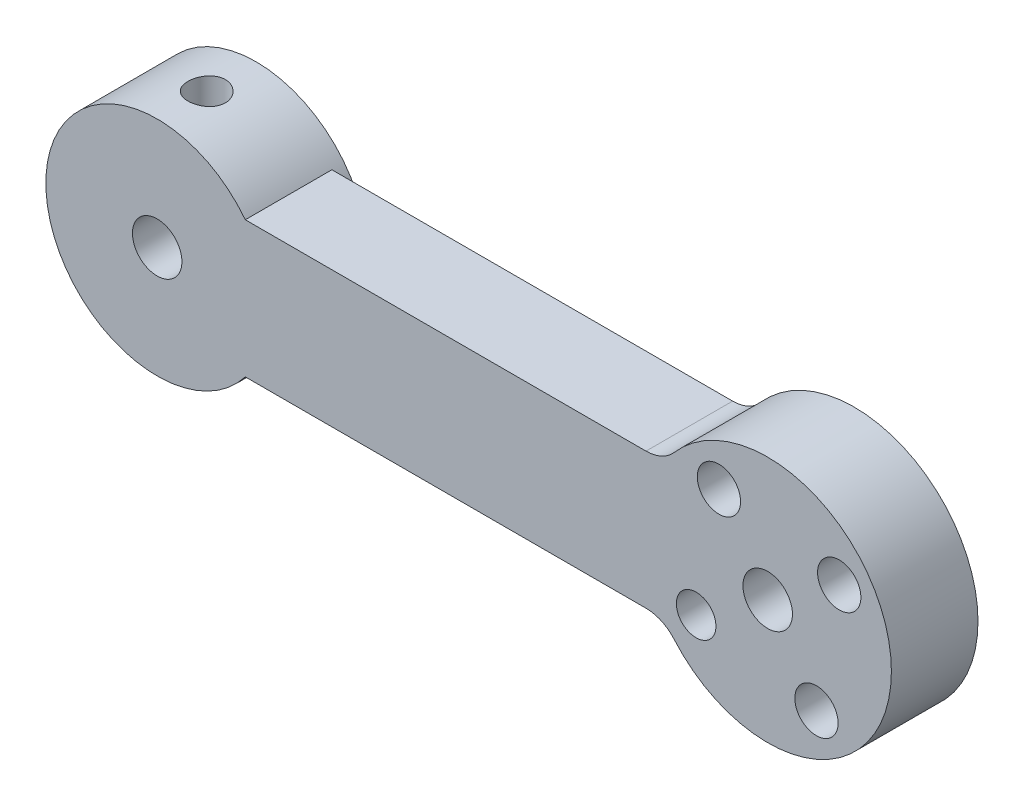
ISO-10303-21;
HEADER;
FILE_DESCRIPTION(('STEP AP214'),'2;1');
FILE_NAME('part.step','',(''),(''),'','','');
FILE_SCHEMA(('AUTOMOTIVE_DESIGN { 1 0 10303 214 1 1 1 1 }'));
ENDSEC;
DATA;
#1=APPLICATION_CONTEXT('core data for automotive mechanical design processes');
#2=APPLICATION_PROTOCOL_DEFINITION('international standard','automotive_design',2000,#1);
#3=PRODUCT_CONTEXT('',#1,'mechanical');
#4=PRODUCT('Part','Part','',(#3));
#5=PRODUCT_RELATED_PRODUCT_CATEGORY('part','',(#4));
#6=PRODUCT_DEFINITION_FORMATION('','',#4);
#7=PRODUCT_DEFINITION_CONTEXT('part definition',#1,'design');
#8=PRODUCT_DEFINITION('design','',#6,#7);
#9=PRODUCT_DEFINITION_SHAPE('','',#8);
#10=(LENGTH_UNIT() NAMED_UNIT(*) SI_UNIT(.MILLI.,.METRE.));
#11=(NAMED_UNIT(*) PLANE_ANGLE_UNIT() SI_UNIT($,.RADIAN.));
#12=(NAMED_UNIT(*) SI_UNIT($,.STERADIAN.) SOLID_ANGLE_UNIT());
#13=UNCERTAINTY_MEASURE_WITH_UNIT(LENGTH_MEASURE(1.E-05),#10,'distance_accuracy_value','');
#14=(GEOMETRIC_REPRESENTATION_CONTEXT(3) GLOBAL_UNCERTAINTY_ASSIGNED_CONTEXT((#13)) GLOBAL_UNIT_ASSIGNED_CONTEXT((#10,
#11,#12)) REPRESENTATION_CONTEXT('',''));
#15=CARTESIAN_POINT('',(0.,0.,0.));
#16=DIRECTION('',(0.,0.,1.));
#17=DIRECTION('',(1.,0.,0.));
#18=AXIS2_PLACEMENT_3D('',#15,#16,#17);
#19=CARTESIAN_POINT('',(0.,0.,7.));
#20=DIRECTION('',(0.,1.,0.));
#21=DIRECTION('',(0.,0.,1.));
#22=AXIS2_PLACEMENT_3D('',#19,#20,#21);
#23=PLANE('',#22);
#24=DIRECTION('',(1.,0.,0.));
#25=VECTOR('',#24,1.);
#26=CARTESIAN_POINT('',(0.,0.,7.));
#27=LINE('',#26,#25);
#28=CARTESIAN_POINT('',(11.1239034243875,0.,7.));
#29=VERTEX_POINT('',#28);
#30=CARTESIAN_POINT('',(43.515488757792,0.,7.));
#31=VERTEX_POINT('',#30);
#32=EDGE_CURVE('E65',#29,#31,#27,.T.);
#33=ORIENTED_EDGE('',*,*,#32,.F.);
#34=DIRECTION('',(0.,0.,1.));
#35=VECTOR('',#34,1.);
#36=CARTESIAN_POINT('',(11.1239034243875,0.,-1.));
#37=LINE('',#36,#35);
#38=CARTESIAN_POINT('',(11.1239034243875,0.,0.));
#39=VERTEX_POINT('',#38);
#40=EDGE_CURVE('E107',#29,#39,#37,.F.);
#41=ORIENTED_EDGE('',*,*,#40,.T.);
#42=DIRECTION('',(1.,0.,0.));
#43=VECTOR('',#42,1.);
#44=CARTESIAN_POINT('',(0.,0.,0.));
#45=LINE('',#44,#43);
#46=CARTESIAN_POINT('',(43.515488757792,0.,0.));
#47=VERTEX_POINT('',#46);
#48=EDGE_CURVE('E97',#39,#47,#45,.T.);
#49=ORIENTED_EDGE('',*,*,#48,.T.);
#50=DIRECTION('',(0.,0.,1.));
#51=VECTOR('',#50,1.);
#52=CARTESIAN_POINT('',(43.515488757792,0.,7.));
#53=LINE('',#52,#51);
#54=EDGE_CURVE('E146',#47,#31,#53,.T.);
#55=ORIENTED_EDGE('',*,*,#54,.T.);
#56=EDGE_LOOP('',(#33,#41,#49,#55));
#57=FACE_BOUND('',#56,.T.);
#58=ADVANCED_FACE('F35',(#57),#23,.F.);
#59=CARTESIAN_POINT('',(53.351646544245,5.5,7.));
#60=DIRECTION('',(0.,0.,-1.));
#61=DIRECTION('',(-1.,0.,0.));
#62=AXIS2_PLACEMENT_3D('',#59,#60,#61);
#63=CYLINDRICAL_SURFACE('',#62,10.);
#64=CARTESIAN_POINT('',(53.351646544245,5.5,0.));
#65=DIRECTION('',(0.,0.,1.));
#66=DIRECTION('',(-1.,0.,0.));
#67=AXIS2_PLACEMENT_3D('',#64,#65,#66);
#68=CIRCLE('',#67,10.);
#69=CARTESIAN_POINT('',(45.7853713238966,-1.03846153846154,0.));
#70=VERTEX_POINT('',#69);
#71=CARTESIAN_POINT('',(45.7853713238966,12.0384615384615,0.));
#72=VERTEX_POINT('',#71);
#73=EDGE_CURVE('E104',#70,#72,#68,.T.);
#74=ORIENTED_EDGE('',*,*,#73,.T.);
#75=DIRECTION('',(0.,0.,-1.));
#76=VECTOR('',#75,1.);
#77=CARTESIAN_POINT('',(45.7853713238966,12.0384615384615,7.));
#78=LINE('',#77,#76);
#79=CARTESIAN_POINT('',(45.7853713238966,12.0384615384615,7.));
#80=VERTEX_POINT('',#79);
#81=EDGE_CURVE('E144',#72,#80,#78,.F.);
#82=ORIENTED_EDGE('',*,*,#81,.T.);
#83=CARTESIAN_POINT('',(53.351646544245,5.5,7.));
#84=DIRECTION('',(0.,0.,1.));
#85=DIRECTION('',(-1.,0.,0.));
#86=AXIS2_PLACEMENT_3D('',#83,#84,#85);
#87=CIRCLE('',#86,10.);
#88=CARTESIAN_POINT('',(45.7853713238966,-1.03846153846154,7.));
#89=VERTEX_POINT('',#88);
#90=EDGE_CURVE('E129',#89,#80,#87,.T.);
#91=ORIENTED_EDGE('',*,*,#90,.F.);
#92=DIRECTION('',(0.,0.,-1.));
#93=VECTOR('',#92,1.);
#94=CARTESIAN_POINT('',(45.7853713238966,-1.03846153846154,7.));
#95=LINE('',#94,#93);
#96=EDGE_CURVE('E141',#89,#70,#95,.T.);
#97=ORIENTED_EDGE('',*,*,#96,.T.);
#98=EDGE_LOOP('',(#74,#82,#91,#97));
#99=FACE_BOUND('',#98,.T.);
#100=ADVANCED_FACE('F205',(#99),#63,.T.);
#101=CARTESIAN_POINT('',(0.,11.,7.));
#102=DIRECTION('',(0.,-1.,0.));
#103=DIRECTION('',(0.,0.,-1.));
#104=AXIS2_PLACEMENT_3D('',#101,#102,#103);
#105=PLANE('',#104);
#106=DIRECTION('',(-1.,0.,0.));
#107=VECTOR('',#106,1.);
#108=CARTESIAN_POINT('',(0.,11.,0.));
#109=LINE('',#108,#107);
#110=CARTESIAN_POINT('',(43.515488757792,11.,0.));
#111=VERTEX_POINT('',#110);
#112=CARTESIAN_POINT('',(11.1239034243875,11.,0.));
#113=VERTEX_POINT('',#112);
#114=EDGE_CURVE('E130',#111,#113,#109,.T.);
#115=ORIENTED_EDGE('',*,*,#114,.T.);
#116=DIRECTION('',(0.,0.,1.));
#117=VECTOR('',#116,1.);
#118=CARTESIAN_POINT('',(11.1239034243875,11.,-1.));
#119=LINE('',#118,#117);
#120=CARTESIAN_POINT('',(11.1239034243875,11.,7.));
#121=VERTEX_POINT('',#120);
#122=EDGE_CURVE('E57',#113,#121,#119,.T.);
#123=ORIENTED_EDGE('',*,*,#122,.T.);
#124=DIRECTION('',(-1.,0.,0.));
#125=VECTOR('',#124,1.);
#126=CARTESIAN_POINT('',(0.,11.,7.));
#127=LINE('',#126,#125);
#128=CARTESIAN_POINT('',(43.515488757792,11.,7.));
#129=VERTEX_POINT('',#128);
#130=EDGE_CURVE('E133',#129,#121,#127,.T.);
#131=ORIENTED_EDGE('',*,*,#130,.F.);
#132=DIRECTION('',(0.,0.,1.));
#133=VECTOR('',#132,1.);
#134=CARTESIAN_POINT('',(43.515488757792,11.,0.));
#135=LINE('',#134,#133);
#136=EDGE_CURVE('E134',#129,#111,#135,.F.);
#137=ORIENTED_EDGE('',*,*,#136,.T.);
#138=EDGE_LOOP('',(#115,#123,#131,#137));
#139=FACE_BOUND('',#138,.T.);
#140=ADVANCED_FACE('F198',(#139),#105,.F.);
#141=CARTESIAN_POINT('',(53.351646544245,5.5,7.));
#142=DIRECTION('',(0.,0.,-1.));
#143=DIRECTION('',(-1.,0.,0.));
#144=AXIS2_PLACEMENT_3D('',#141,#142,#143);
#145=PLANE('',#144);
#146=CARTESIAN_POINT('',(57.2945205721571,-0.283921195868525,7.));
#147=DIRECTION('',(0.,0.,-1.));
#148=DIRECTION('',(-1.,0.,0.));
#149=AXIS2_PLACEMENT_3D('',#146,#147,#148);
#150=CIRCLE('',#149,1.75);
#151=CARTESIAN_POINT('',(55.5445205721571,-0.283921195868525,7.));
#152=VERTEX_POINT('',#151);
#153=EDGE_CURVE('E235',#152,#152,#150,.T.);
#154=ORIENTED_EDGE('',*,*,#153,.T.);
#155=EDGE_LOOP('',(#154));
#156=FACE_BOUND('',#155,.T.);
#157=CARTESIAN_POINT('',(59.1355677401137,9.44287402791192,7.));
#158=DIRECTION('',(0.,0.,-1.));
#159=DIRECTION('',(-1.,0.,0.));
#160=AXIS2_PLACEMENT_3D('',#157,#158,#159);
#161=CIRCLE('',#160,1.75);
#162=CARTESIAN_POINT('',(57.3855677401137,9.44287402791192,7.));
#163=VERTEX_POINT('',#162);
#164=EDGE_CURVE('E246',#163,#163,#161,.T.);
#165=ORIENTED_EDGE('',*,*,#164,.T.);
#166=EDGE_LOOP('',(#165));
#167=FACE_BOUND('',#166,.T.);
#168=CARTESIAN_POINT('',(49.4087725163332,11.2839211958686,7.));
#169=DIRECTION('',(0.,0.,-1.));
#170=DIRECTION('',(-1.,0.,0.));
#171=AXIS2_PLACEMENT_3D('',#168,#169,#170);
#172=CIRCLE('',#171,1.75);
#173=CARTESIAN_POINT('',(47.6587725163332,11.2839211958686,7.));
#174=VERTEX_POINT('',#173);
#175=EDGE_CURVE('E240',#174,#174,#172,.T.);
#176=ORIENTED_EDGE('',*,*,#175,.T.);
#177=EDGE_LOOP('',(#176));
#178=FACE_BOUND('',#177,.T.);
#179=CARTESIAN_POINT('',(47.5677253483766,1.55712597208806,7.));
#180=DIRECTION('',(0.,0.,-1.));
#181=DIRECTION('',(-1.,0.,0.));
#182=AXIS2_PLACEMENT_3D('',#179,#180,#181);
#183=CIRCLE('',#182,1.6);
#184=CARTESIAN_POINT('',(45.9677253483766,1.55712597208806,7.));
#185=VERTEX_POINT('',#184);
#186=EDGE_CURVE('E226',#185,#185,#183,.T.);
#187=ORIENTED_EDGE('',*,*,#186,.T.);
#188=EDGE_LOOP('',(#187));
#189=FACE_BOUND('',#188,.T.);
#190=CARTESIAN_POINT('',(4.,5.5,7.));
#191=DIRECTION('',(0.,0.,1.));
#192=DIRECTION('',(1.,0.,0.));
#193=AXIS2_PLACEMENT_3D('',#190,#191,#192);
#194=CIRCLE('',#193,9.);
#195=EDGE_CURVE('E114',#121,#29,#194,.T.);
#196=ORIENTED_EDGE('',*,*,#195,.T.);
#197=ORIENTED_EDGE('',*,*,#32,.T.);
#198=CARTESIAN_POINT('',(43.515488757792,-3.,7.));
#199=DIRECTION('',(0.,0.,-1.));
#200=DIRECTION('',(-1.,0.,0.));
#201=AXIS2_PLACEMENT_3D('',#198,#199,#200);
#202=CIRCLE('',#201,3.);
#203=EDGE_CURVE('E49',#31,#89,#202,.T.);
#204=ORIENTED_EDGE('',*,*,#203,.T.);
#205=ORIENTED_EDGE('',*,*,#90,.T.);
#206=CARTESIAN_POINT('',(43.515488757792,14.,7.));
#207=DIRECTION('',(0.,0.,-1.));
#208=DIRECTION('',(-1.,0.,0.));
#209=AXIS2_PLACEMENT_3D('',#206,#207,#208);
#210=CIRCLE('',#209,3.);
#211=EDGE_CURVE('E150',#80,#129,#210,.T.);
#212=ORIENTED_EDGE('',*,*,#211,.T.);
#213=ORIENTED_EDGE('',*,*,#130,.T.);
#214=EDGE_LOOP('',(#196,#197,#204,#205,#212,#213));
#215=FACE_BOUND('',#214,.T.);
#216=CARTESIAN_POINT('',(53.351646544245,5.5,7.));
#217=DIRECTION('',(0.,0.,1.));
#218=DIRECTION('',(1.,0.,0.));
#219=AXIS2_PLACEMENT_3D('',#216,#217,#218);
#220=CIRCLE('',#219,2.);
#221=CARTESIAN_POINT('',(55.351646544245,5.5,7.));
#222=VERTEX_POINT('',#221);
#223=EDGE_CURVE('E123',#222,#222,#220,.T.);
#224=ORIENTED_EDGE('',*,*,#223,.F.);
#225=EDGE_LOOP('',(#224));
#226=FACE_BOUND('',#225,.T.);
#227=CARTESIAN_POINT('',(4.,5.5,7.));
#228=DIRECTION('',(0.,0.,1.));
#229=DIRECTION('',(1.,0.,0.));
#230=AXIS2_PLACEMENT_3D('',#227,#228,#229);
#231=CIRCLE('',#230,2.);
#232=CARTESIAN_POINT('',(6.,5.5,7.));
#233=VERTEX_POINT('',#232);
#234=EDGE_CURVE('E111',#233,#233,#231,.T.);
#235=ORIENTED_EDGE('',*,*,#234,.F.);
#236=EDGE_LOOP('',(#235));
#237=FACE_BOUND('',#236,.T.);
#238=ADVANCED_FACE('F195',(#156,#167,#178,#189,#215,#226,#237),#145,.F.);
#239=CARTESIAN_POINT('',(53.351646544245,5.5,0.));
#240=DIRECTION('',(0.,0.,-1.));
#241=DIRECTION('',(-1.,0.,0.));
#242=AXIS2_PLACEMENT_3D('',#239,#240,#241);
#243=PLANE('',#242);
#244=CARTESIAN_POINT('',(57.2945205721571,-0.283921195868525,0.));
#245=DIRECTION('',(0.,0.,-1.));
#246=DIRECTION('',(-1.,0.,0.));
#247=AXIS2_PLACEMENT_3D('',#244,#245,#246);
#248=CIRCLE('',#247,1.75);
#249=CARTESIAN_POINT('',(55.5445205721571,-0.283921195868525,0.));
#250=VERTEX_POINT('',#249);
#251=EDGE_CURVE('E249',#250,#250,#248,.T.);
#252=ORIENTED_EDGE('',*,*,#251,.F.);
#253=EDGE_LOOP('',(#252));
#254=FACE_BOUND('',#253,.T.);
#255=CARTESIAN_POINT('',(59.1355677401137,9.44287402791192,0.));
#256=DIRECTION('',(0.,0.,-1.));
#257=DIRECTION('',(-1.,0.,0.));
#258=AXIS2_PLACEMENT_3D('',#255,#256,#257);
#259=CIRCLE('',#258,1.75);
#260=CARTESIAN_POINT('',(57.3855677401137,9.44287402791192,0.));
#261=VERTEX_POINT('',#260);
#262=EDGE_CURVE('E243',#261,#261,#259,.T.);
#263=ORIENTED_EDGE('',*,*,#262,.F.);
#264=EDGE_LOOP('',(#263));
#265=FACE_BOUND('',#264,.T.);
#266=CARTESIAN_POINT('',(49.4087725163332,11.2839211958686,0.));
#267=DIRECTION('',(0.,0.,-1.));
#268=DIRECTION('',(-1.,0.,0.));
#269=AXIS2_PLACEMENT_3D('',#266,#267,#268);
#270=CIRCLE('',#269,1.75);
#271=CARTESIAN_POINT('',(47.6587725163332,11.2839211958686,0.));
#272=VERTEX_POINT('',#271);
#273=EDGE_CURVE('E237',#272,#272,#270,.T.);
#274=ORIENTED_EDGE('',*,*,#273,.F.);
#275=EDGE_LOOP('',(#274));
#276=FACE_BOUND('',#275,.T.);
#277=CARTESIAN_POINT('',(47.5677253483766,1.55712597208806,0.));
#278=DIRECTION('',(0.,0.,-1.));
#279=DIRECTION('',(-1.,0.,0.));
#280=AXIS2_PLACEMENT_3D('',#277,#278,#279);
#281=CIRCLE('',#280,1.6);
#282=CARTESIAN_POINT('',(45.9677253483766,1.55712597208806,0.));
#283=VERTEX_POINT('',#282);
#284=EDGE_CURVE('E231',#283,#283,#281,.T.);
#285=ORIENTED_EDGE('',*,*,#284,.F.);
#286=EDGE_LOOP('',(#285));
#287=FACE_BOUND('',#286,.T.);
#288=CARTESIAN_POINT('',(4.,5.5,0.));
#289=DIRECTION('',(0.,0.,-1.));
#290=DIRECTION('',(-1.,0.,0.));
#291=AXIS2_PLACEMENT_3D('',#288,#289,#290);
#292=CIRCLE('',#291,9.);
#293=EDGE_CURVE('E11',#113,#39,#292,.T.);
#294=ORIENTED_EDGE('',*,*,#293,.F.);
#295=ORIENTED_EDGE('',*,*,#114,.F.);
#296=CARTESIAN_POINT('',(43.515488757792,14.,0.));
#297=DIRECTION('',(0.,0.,-1.));
#298=DIRECTION('',(-1.,0.,0.));
#299=AXIS2_PLACEMENT_3D('',#296,#297,#298);
#300=CIRCLE('',#299,3.);
#301=EDGE_CURVE('E148',#111,#72,#300,.F.);
#302=ORIENTED_EDGE('',*,*,#301,.T.);
#303=ORIENTED_EDGE('',*,*,#73,.F.);
#304=CARTESIAN_POINT('',(43.515488757792,-3.,0.));
#305=DIRECTION('',(0.,0.,-1.));
#306=DIRECTION('',(-1.,0.,0.));
#307=AXIS2_PLACEMENT_3D('',#304,#305,#306);
#308=CIRCLE('',#307,3.);
#309=EDGE_CURVE('E102',#70,#47,#308,.F.);
#310=ORIENTED_EDGE('',*,*,#309,.T.);
#311=ORIENTED_EDGE('',*,*,#48,.F.);
#312=EDGE_LOOP('',(#294,#295,#302,#303,#310,#311));
#313=FACE_BOUND('',#312,.T.);
#314=CARTESIAN_POINT('',(53.351646544245,5.5,0.));
#315=DIRECTION('',(0.,0.,1.));
#316=DIRECTION('',(1.,0.,0.));
#317=AXIS2_PLACEMENT_3D('',#314,#315,#316);
#318=CIRCLE('',#317,2.);
#319=CARTESIAN_POINT('',(55.351646544245,5.5,0.));
#320=VERTEX_POINT('',#319);
#321=EDGE_CURVE('E105',#320,#320,#318,.T.);
#322=ORIENTED_EDGE('',*,*,#321,.T.);
#323=EDGE_LOOP('',(#322));
#324=FACE_BOUND('',#323,.T.);
#325=ADVANCED_FACE('F98',(#254,#265,#276,#287,#313,#324),#243,.T.);
#326=CARTESIAN_POINT('',(53.351646544245,5.5,0.));
#327=DIRECTION('',(0.,0.,1.));
#328=DIRECTION('',(1.,0.,0.));
#329=AXIS2_PLACEMENT_3D('',#326,#327,#328);
#330=CYLINDRICAL_SURFACE('',#329,2.);
#331=ORIENTED_EDGE('',*,*,#321,.F.);
#332=EDGE_LOOP('',(#331));
#333=FACE_BOUND('',#332,.T.);
#334=ORIENTED_EDGE('',*,*,#223,.T.);
#335=EDGE_LOOP('',(#334));
#336=FACE_BOUND('',#335,.T.);
#337=ADVANCED_FACE('F189',(#333,#336),#330,.F.);
#338=CARTESIAN_POINT('',(43.515488757792,14.,7.));
#339=DIRECTION('',(0.,0.,-1.));
#340=DIRECTION('',(-1.,0.,0.));
#341=AXIS2_PLACEMENT_3D('',#338,#339,#340);
#342=CYLINDRICAL_SURFACE('',#341,3.);
#343=ORIENTED_EDGE('',*,*,#211,.F.);
#344=ORIENTED_EDGE('',*,*,#81,.F.);
#345=ORIENTED_EDGE('',*,*,#301,.F.);
#346=ORIENTED_EDGE('',*,*,#136,.F.);
#347=EDGE_LOOP('',(#343,#344,#345,#346));
#348=FACE_BOUND('',#347,.T.);
#349=ADVANCED_FACE('F193',(#348),#342,.F.);
#350=CARTESIAN_POINT('',(43.515488757792,-3.,7.));
#351=DIRECTION('',(0.,0.,-1.));
#352=DIRECTION('',(-1.,0.,0.));
#353=AXIS2_PLACEMENT_3D('',#350,#351,#352);
#354=CYLINDRICAL_SURFACE('',#353,3.);
#355=ORIENTED_EDGE('',*,*,#203,.F.);
#356=ORIENTED_EDGE('',*,*,#54,.F.);
#357=ORIENTED_EDGE('',*,*,#309,.F.);
#358=ORIENTED_EDGE('',*,*,#96,.F.);
#359=EDGE_LOOP('',(#355,#356,#357,#358));
#360=FACE_BOUND('',#359,.T.);
#361=ADVANCED_FACE('F37',(#360),#354,.F.);
#362=CARTESIAN_POINT('',(4.,5.5,0.));
#363=DIRECTION('',(0.,0.,1.));
#364=DIRECTION('',(1.,0.,0.));
#365=AXIS2_PLACEMENT_3D('',#362,#363,#364);
#366=CYLINDRICAL_SURFACE('',#365,2.);
#367=CARTESIAN_POINT('',(4.,3.5,4.51));
#368=CARTESIAN_POINT('',(3.92639830532739,3.50000528853365,4.50999449894191));
#369=CARTESIAN_POINT('',(3.85268931648202,3.50410524219255,4.50457546150072));
#370=CARTESIAN_POINT('',(3.70760319651571,3.5201360326529,4.4832427106267));
#371=CARTESIAN_POINT('',(3.63623174804846,3.53208465232593,4.46730516481998));
#372=CARTESIAN_POINT('',(3.49830138949906,3.56266666574502,4.42602635408294));
#373=CARTESIAN_POINT('',(3.43171632711722,3.58125978553347,4.40074171306692));
#374=CARTESIAN_POINT('',(3.30418261685799,3.62373711597108,4.34196653192493));
#375=CARTESIAN_POINT('',(3.24323270639039,3.64762013729346,4.30847783613464));
#376=CARTESIAN_POINT('',(3.12223794453197,3.70157882602526,4.23096207297712));
#377=CARTESIAN_POINT('',(3.06280328518413,3.73202368281014,4.18624498053835));
#378=CARTESIAN_POINT('',(2.95178221918921,3.79549459607059,4.08939323852539));
#379=CARTESIAN_POINT('',(2.90020796491048,3.82852453218988,4.03724733986094));
#380=CARTESIAN_POINT('',(2.79542776467944,3.90191221072477,3.91481224881198));
#381=CARTESIAN_POINT('',(2.74407222329295,3.94237848605459,3.84299804889245));
#382=CARTESIAN_POINT('',(2.65395242699001,4.01957537802608,3.69001346949625));
#383=CARTESIAN_POINT('',(2.61517157515705,4.05631087442734,3.60885561581322));
#384=CARTESIAN_POINT('',(2.5628600364284,4.1087778704745,3.46720489336871));
#385=CARTESIAN_POINT('',(2.54523649157878,4.12737614004803,3.40930014049405));
#386=CARTESIAN_POINT('',(2.51689290305279,4.15804906999444,3.29021137859128));
#387=CARTESIAN_POINT('',(2.50615690826851,4.1701387931978,3.229035304626));
#388=CARTESIAN_POINT('',(2.49227342652996,4.18589075231182,3.10410083366028));
#389=CARTESIAN_POINT('',(2.4891980399106,4.18947290186829,3.04032360151692));
#390=CARTESIAN_POINT('',(2.4911619055566,4.18721355604122,2.91305084874179));
#391=CARTESIAN_POINT('',(2.49620356030799,4.18136927061574,2.84955541709569));
#392=CARTESIAN_POINT('',(2.51291694211066,4.16257255787147,2.73201225051991));
#393=CARTESIAN_POINT('',(2.52378702198194,4.15048503684945,2.67770031539725));
#394=CARTESIAN_POINT('',(2.55094424141307,4.12136489026237,2.5718312809864));
#395=CARTESIAN_POINT('',(2.5672367419663,4.10432737290271,2.52027696686318));
#396=CARTESIAN_POINT('',(2.61657196160903,4.05501528767408,2.38856731612115));
#397=CARTESIAN_POINT('',(2.65368651413652,4.01992702958203,2.31099148743748));
#398=CARTESIAN_POINT('',(2.73946577754432,3.94620660616628,2.16429702730436));
#399=CARTESIAN_POINT('',(2.78815892909537,3.90756586048166,2.09519986592298));
#400=CARTESIAN_POINT('',(2.89792790353092,3.82964249007707,1.96412741535855));
#401=CARTESIAN_POINT('',(2.95930229984875,3.7903706650414,1.90239449778229));
#402=CARTESIAN_POINT('',(3.09309768264511,3.71579845339001,1.78952095974904));
#403=CARTESIAN_POINT('',(3.16549743611945,3.68049065504586,1.7383604157363));
#404=CARTESIAN_POINT('',(3.30529996420518,3.62332100236116,1.65736415471505));
#405=CARTESIAN_POINT('',(3.37089113822137,3.60018029695292,1.62531363777785));
#406=CARTESIAN_POINT('',(3.50771303563426,3.56022709233806,1.57060515545573));
#407=CARTESIAN_POINT('',(3.57894027440428,3.54341071940321,1.54794143967974));
#408=CARTESIAN_POINT('',(3.72581818255495,3.5174727126177,1.51317452887283));
#409=CARTESIAN_POINT('',(3.80149406691624,3.50840061452033,1.50113930163159));
#410=CARTESIAN_POINT('',(3.9543296234153,3.4990590988794,1.48874808611542));
#411=CARTESIAN_POINT('',(4.03148857806106,3.49878552688136,1.48838658578432));
#412=CARTESIAN_POINT('',(4.1764422791812,3.50661488909488,1.49876981331977));
#413=CARTESIAN_POINT('',(4.244372996971,3.51384547404651,1.50835789883884));
#414=CARTESIAN_POINT('',(4.37735113583207,3.53476754115623,1.53633177845625));
#415=CARTESIAN_POINT('',(4.44239797038637,3.54846033104732,1.55471935328592));
#416=CARTESIAN_POINT('',(4.57015443491001,3.5818185024901,1.60008432113716));
#417=CARTESIAN_POINT('',(4.63273025302593,3.60165494726934,1.62730897829943));
#418=CARTESIAN_POINT('',(4.75239630408821,3.64582264470788,1.6890695091443));
#419=CARTESIAN_POINT('',(4.80948574684196,3.67015454336868,1.72360643371176));
#420=CARTESIAN_POINT('',(4.92666851684622,3.72625471335187,1.80530294968228));
#421=CARTESIAN_POINT('',(4.9856920999003,3.75858712261344,1.85360585515412));
#422=CARTESIAN_POINT('',(5.09534955906628,3.82538219007377,1.95786366675591));
#423=CARTESIAN_POINT('',(5.14596519470037,3.85984926266946,2.01383474091552));
#424=CARTESIAN_POINT('',(5.24744861960476,3.93520288577085,2.14437470878171));
#425=CARTESIAN_POINT('',(5.29644409369543,3.97603176753247,2.22044240222522));
#426=CARTESIAN_POINT('',(5.38087441642096,4.05210590959651,2.38228676273725));
#427=CARTESIAN_POINT('',(5.41634526417548,4.08736584420378,2.46803685690434));
#428=CARTESIAN_POINT('',(5.46087640193839,4.13381848579857,2.613629310809));
#429=CARTESIAN_POINT('',(5.47484538910532,4.14904512464538,2.67066481529595));
#430=CARTESIAN_POINT('',(5.49611194809649,4.17263217639514,2.78729038827332));
#431=CARTESIAN_POINT('',(5.50342500491853,4.18100852184702,2.84687418797223));
#432=CARTESIAN_POINT('',(5.51086322004912,4.18953020690866,2.96747411368641));
#433=CARTESIAN_POINT('',(5.51094463100661,4.18962545048101,3.0284967236646));
#434=CARTESIAN_POINT('',(5.50380124508993,4.18143801748131,3.14956878275869));
#435=CARTESIAN_POINT('',(5.49656797761149,4.17314562779046,3.209617021614));
#436=CARTESIAN_POINT('',(5.47334349725826,4.14737081699067,3.33824906450535));
#437=CARTESIAN_POINT('',(5.45594493300073,4.1284371610357,3.40627623496078));
#438=CARTESIAN_POINT('',(5.4128254126076,4.08406276156576,3.5374169451152));
#439=CARTESIAN_POINT('',(5.38708315848007,4.05860540092479,3.6005173918962));
#440=CARTESIAN_POINT('',(5.31730204832477,3.99410550934505,3.74384965248189));
#441=CARTESIAN_POINT('',(5.27001708862936,3.95351819453114,3.82180069533363));
#442=CARTESIAN_POINT('',(5.16267369081747,3.8712628187671,3.96772873231435));
#443=CARTESIAN_POINT('',(5.1026021870063,3.82959369091921,4.03569540311241));
#444=CARTESIAN_POINT('',(4.96940460285949,3.74888781796274,4.16139103203262));
#445=CARTESIAN_POINT('',(4.89613977328882,3.70988580485528,4.21899672836054));
#446=CARTESIAN_POINT('',(4.73780682479645,3.63905698807107,4.32081010574521));
#447=CARTESIAN_POINT('',(4.65276740897043,3.60721321545262,4.3650495597018));
#448=CARTESIAN_POINT('',(4.49908527848525,3.56212645937504,4.42679845956763));
#449=CARTESIAN_POINT('',(4.43284375023388,3.54616729129633,4.44833921250915));
#450=CARTESIAN_POINT('',(4.29689352129899,3.52096051655074,4.48216990021778));
#451=CARTESIAN_POINT('',(4.22719444927461,3.51169527889732,4.49448413968067));
#452=CARTESIAN_POINT('',(4.13078514802233,3.50410896249281,4.50455402816545));
#453=CARTESIAN_POINT('',(4.1047000400845,3.50257116958673,4.50659310595978));
#454=CARTESIAN_POINT('',(4.05241450629218,3.50051564402922,4.50931720760427));
#455=CARTESIAN_POINT('',(4.02621405831696,3.4999981164302,4.51000195926274));
#456=CARTESIAN_POINT('',(4.,3.5,4.51));
#457=B_SPLINE_CURVE_WITH_KNOTS('',3,(#367,#368,#369,#370,#371,#372,#373,#374,#375,#376,#377,
#378,#379,#380,#381,#382,#383,#384,#385,#386,#387,#388,#389,#390,#391,#392,#393,#394,#395,#396,
#397,#398,#399,#400,#401,#402,#403,#404,#405,#406,#407,#408,#409,#410,#411,#412,#413,#414,#415,
#416,#417,#418,#419,#420,#421,#422,#423,#424,#425,#426,#427,#428,#429,#430,#431,#432,#433,#434,
#435,#436,#437,#438,#439,#440,#441,#442,#443,#444,#445,#446,#447,#448,#449,#450,#451,#452,#453,
#454,#455,#456),.UNSPECIFIED.,.T.,.F.,(4,2,2,2,2,2,2,2,2,2,2,2,2,2,2,2,2,2,2,2,2,2,2,2,2,2,2,2,
2,2,2,2,2,2,2,2,2,2,2,2,2,2,2,2,4),(0.,0.220691351923994,0.441884461191212,0.661758991588343,
0.881584137757824,1.12183264578999,1.36244889593056,1.65260667182984,1.94237990427407,
2.13170975578062,2.32059953378444,2.51126050458867,2.70197791769881,2.8714373487947,
3.0410648197957,3.31818991284902,3.59600287464616,3.88130934206777,4.16607314744633,
4.39490527881519,4.62359701863962,4.85374083770857,5.08377598675108,5.28977268846872,
5.4958110948794,5.70819937822072,5.92061820575603,6.16823499508793,6.41638214851531,
6.71287755886399,7.00857817091223,7.18991252598882,7.37082392086235,7.55282965287214,
7.73504639429322,7.95201975811411,8.1695513854883,8.46742916690045,8.76561280311905,
9.06713796400548,9.36794062559214,9.58147019641608,9.7944352857712,9.87302116123783,
9.9516228292445),.UNSPECIFIED.);
#458=CARTESIAN_POINT('',(4.,3.5,4.51));
#459=VERTEX_POINT('',#458);
#460=EDGE_CURVE('E179',#459,#459,#457,.T.);
#461=ORIENTED_EDGE('',*,*,#460,.T.);
#462=EDGE_LOOP('',(#461));
#463=FACE_BOUND('',#462,.T.);
#464=CARTESIAN_POINT('',(4.,7.5,4.51));
#465=CARTESIAN_POINT('',(4.07360169467261,7.49999471146635,4.50999449894191));
#466=CARTESIAN_POINT('',(4.14731068351798,7.49589475780745,4.50457546150072));
#467=CARTESIAN_POINT('',(4.29239680348429,7.4798639673471,4.4832427106267));
#468=CARTESIAN_POINT('',(4.36376825195154,7.46791534767407,4.46730516481998));
#469=CARTESIAN_POINT('',(4.50169861050094,7.43733333425498,4.42602635408294));
#470=CARTESIAN_POINT('',(4.56828367288278,7.41874021446653,4.40074171306692));
#471=CARTESIAN_POINT('',(4.69581738314201,7.37626288402892,4.34196653192493));
#472=CARTESIAN_POINT('',(4.75676729360961,7.35237986270654,4.30847783613464));
#473=CARTESIAN_POINT('',(4.87776205546803,7.29842117397474,4.23096207297712));
#474=CARTESIAN_POINT('',(4.93719671481587,7.26797631718986,4.18624498053835));
#475=CARTESIAN_POINT('',(5.04821778081079,7.20450540392941,4.08939323852539));
#476=CARTESIAN_POINT('',(5.09979203508952,7.17147546781012,4.03724733986094));
#477=CARTESIAN_POINT('',(5.20457223532056,7.09808778927523,3.91481224881198));
#478=CARTESIAN_POINT('',(5.25592777670705,7.05762151394541,3.84299804889245));
#479=CARTESIAN_POINT('',(5.34604757300999,6.98042462197392,3.69001346949626));
#480=CARTESIAN_POINT('',(5.38482842484295,6.94368912557266,3.60885561581322));
#481=CARTESIAN_POINT('',(5.4371399635716,6.8912221295255,3.46720489336871));
#482=CARTESIAN_POINT('',(5.45476350842122,6.87262385995196,3.40930014049405));
#483=CARTESIAN_POINT('',(5.48310709694721,6.84195093000556,3.29021137859128));
#484=CARTESIAN_POINT('',(5.49384309173149,6.8298612068022,3.229035304626));
#485=CARTESIAN_POINT('',(5.50772657347004,6.81410924768818,3.10410083366028));
#486=CARTESIAN_POINT('',(5.5108019600894,6.81052709813171,3.04032360151692));
#487=CARTESIAN_POINT('',(5.5088380944434,6.81278644395878,2.91305084874179));
#488=CARTESIAN_POINT('',(5.50379643969201,6.81863072938426,2.84955541709569));
#489=CARTESIAN_POINT('',(5.48708305788934,6.83742744212853,2.73201225051991));
#490=CARTESIAN_POINT('',(5.47621297801806,6.84951496315054,2.67770031539725));
#491=CARTESIAN_POINT('',(5.44905575858693,6.87863510973763,2.5718312809864));
#492=CARTESIAN_POINT('',(5.4327632580337,6.89567262709728,2.52027696686318));
#493=CARTESIAN_POINT('',(5.38342803839097,6.94498471232592,2.38856731612115));
#494=CARTESIAN_POINT('',(5.34631348586348,6.98007297041797,2.31099148743748));
#495=CARTESIAN_POINT('',(5.26053422245569,7.05379339383372,2.16429702730436));
#496=CARTESIAN_POINT('',(5.21184107090463,7.09243413951834,2.09519986592298));
#497=CARTESIAN_POINT('',(5.10207209646908,7.17035750992293,1.96412741535856));
#498=CARTESIAN_POINT('',(5.04069770015125,7.2096293349586,1.90239449778229));
#499=CARTESIAN_POINT('',(4.90690231735489,7.28420154660999,1.78952095974904));
#500=CARTESIAN_POINT('',(4.83450256388055,7.31950934495414,1.7383604157363));
#501=CARTESIAN_POINT('',(4.69470003579482,7.37667899763884,1.65736415471505));
#502=CARTESIAN_POINT('',(4.62910886177863,7.39981970304708,1.62531363777785));
#503=CARTESIAN_POINT('',(4.49228696436574,7.43977290766194,1.57060515545573));
#504=CARTESIAN_POINT('',(4.42105972559572,7.45658928059679,1.54794143967974));
#505=CARTESIAN_POINT('',(4.27418181744505,7.4825272873823,1.51317452887283));
#506=CARTESIAN_POINT('',(4.19850593308376,7.49159938547967,1.50113930163159));
#507=CARTESIAN_POINT('',(4.0456703765847,7.5009409011206,1.48874808611542));
#508=CARTESIAN_POINT('',(3.96851142193894,7.50121447311864,1.48838658578432));
#509=CARTESIAN_POINT('',(3.8235577208188,7.49338511090512,1.49876981331977));
#510=CARTESIAN_POINT('',(3.755627003029,7.48615452595349,1.50835789883884));
#511=CARTESIAN_POINT('',(3.62264886416793,7.46523245884377,1.53633177845625));
#512=CARTESIAN_POINT('',(3.55760202961363,7.45153966895268,1.55471935328592));
#513=CARTESIAN_POINT('',(3.42984556508999,7.41818149750989,1.60008432113716));
#514=CARTESIAN_POINT('',(3.36726974697406,7.39834505273066,1.62730897829943));
#515=CARTESIAN_POINT('',(3.24760369591178,7.35417735529212,1.6890695091443));
#516=CARTESIAN_POINT('',(3.19051425315804,7.32984545663132,1.72360643371176));
#517=CARTESIAN_POINT('',(3.07333148315378,7.27374528664813,1.80530294968228));
#518=CARTESIAN_POINT('',(3.0143079000997,7.24141287738656,1.85360585515412));
#519=CARTESIAN_POINT('',(2.90465044093372,7.17461780992623,1.95786366675591));
#520=CARTESIAN_POINT('',(2.85403480529963,7.14015073733054,2.01383474091552));
#521=CARTESIAN_POINT('',(2.75255138039524,7.06479711422915,2.14437470878172));
#522=CARTESIAN_POINT('',(2.70355590630456,7.02396823246752,2.22044240222523));
#523=CARTESIAN_POINT('',(2.61912558357904,6.94789409040349,2.38228676273725));
#524=CARTESIAN_POINT('',(2.58365473582452,6.91263415579622,2.46803685690434));
#525=CARTESIAN_POINT('',(2.53912359806161,6.86618151420143,2.613629310809));
#526=CARTESIAN_POINT('',(2.52515461089468,6.85095487535462,2.67066481529595));
#527=CARTESIAN_POINT('',(2.50388805190351,6.82736782360486,2.78729038827332));
#528=CARTESIAN_POINT('',(2.49657499508147,6.81899147815298,2.84687418797223));
#529=CARTESIAN_POINT('',(2.48913677995088,6.81046979309134,2.96747411368642));
#530=CARTESIAN_POINT('',(2.48905536899339,6.81037454951899,3.0284967236646));
#531=CARTESIAN_POINT('',(2.49619875491007,6.81856198251869,3.14956878275869));
#532=CARTESIAN_POINT('',(2.50343202238851,6.82685437220954,3.209617021614));
#533=CARTESIAN_POINT('',(2.52665650274174,6.85262918300933,3.33824906450535));
#534=CARTESIAN_POINT('',(2.54405506699927,6.8715628389643,3.40627623496078));
#535=CARTESIAN_POINT('',(2.5871745873924,6.91593723843424,3.5374169451152));
#536=CARTESIAN_POINT('',(2.61291684151993,6.9413945990752,3.6005173918962));
#537=CARTESIAN_POINT('',(2.68269795167523,7.00589449065495,3.74384965248189));
#538=CARTESIAN_POINT('',(2.72998291137064,7.04648180546886,3.82180069533363));
#539=CARTESIAN_POINT('',(2.83732630918254,7.1287371812329,3.96772873231435));
#540=CARTESIAN_POINT('',(2.8973978129937,7.17040630908079,4.03569540311241));
#541=CARTESIAN_POINT('',(3.03059539714051,7.25111218203726,4.16139103203262));
#542=CARTESIAN_POINT('',(3.10386022671118,7.29011419514472,4.21899672836054));
#543=CARTESIAN_POINT('',(3.26219317520356,7.36094301192893,4.32081010574521));
#544=CARTESIAN_POINT('',(3.34723259102957,7.39278678454738,4.3650495597018));
#545=CARTESIAN_POINT('',(3.50091472151475,7.43787354062496,4.42679845956763));
#546=CARTESIAN_POINT('',(3.56715624976612,7.45383270870367,4.44833921250915));
#547=CARTESIAN_POINT('',(3.70310647870101,7.47903948344926,4.48216990021778));
#548=CARTESIAN_POINT('',(3.77280555072539,7.48830472110268,4.49448413968067));
#549=CARTESIAN_POINT('',(3.86921485197767,7.49589103750719,4.50455402816545));
#550=CARTESIAN_POINT('',(3.8952999599155,7.49742883041327,4.50659310595978));
#551=CARTESIAN_POINT('',(3.94758549370782,7.49948435597078,4.50931720760427));
#552=CARTESIAN_POINT('',(3.97378594168304,7.5000018835698,4.51000195926274));
#553=CARTESIAN_POINT('',(4.,7.5,4.51));
#554=B_SPLINE_CURVE_WITH_KNOTS('',3,(#464,#465,#466,#467,#468,#469,#470,#471,#472,#473,#474,
#475,#476,#477,#478,#479,#480,#481,#482,#483,#484,#485,#486,#487,#488,#489,#490,#491,#492,#493,
#494,#495,#496,#497,#498,#499,#500,#501,#502,#503,#504,#505,#506,#507,#508,#509,#510,#511,#512,
#513,#514,#515,#516,#517,#518,#519,#520,#521,#522,#523,#524,#525,#526,#527,#528,#529,#530,#531,
#532,#533,#534,#535,#536,#537,#538,#539,#540,#541,#542,#543,#544,#545,#546,#547,#548,#549,#550,
#551,#552,#553),.UNSPECIFIED.,.T.,.F.,(4,2,2,2,2,2,2,2,2,2,2,2,2,2,2,2,2,2,2,2,2,2,2,2,2,2,2,2,
2,2,2,2,2,2,2,2,2,2,2,2,2,2,2,2,4),(0.,0.220691351923993,0.441884461191212,0.661758991588342,
0.881584137757824,1.12183264578998,1.36244889593056,1.65260667182983,1.94237990427407,
2.13170975578062,2.32059953378444,2.51126050458867,2.7019779176988,2.8714373487947,
3.0410648197957,3.31818991284902,3.59600287464616,3.88130934206777,4.16607314744633,
4.3949052788152,4.62359701863962,4.85374083770857,5.08377598675108,5.28977268846872,
5.4958110948794,5.70819937822073,5.92061820575604,6.16823499508794,6.41638214851531,
6.71287755886399,7.00857817091223,7.18991252598882,7.37082392086235,7.55282965287214,
7.73504639429322,7.95201975811411,8.1695513854883,8.46742916690045,8.76561280311905,
9.06713796400548,9.36794062559214,9.58147019641608,9.7944352857712,9.87302116123783,
9.9516228292445),.UNSPECIFIED.);
#555=CARTESIAN_POINT('',(4.,7.5,4.51));
#556=VERTEX_POINT('',#555);
#557=EDGE_CURVE('E174',#556,#556,#554,.T.);
#558=ORIENTED_EDGE('',*,*,#557,.T.);
#559=EDGE_LOOP('',(#558));
#560=FACE_BOUND('',#559,.T.);
#561=ORIENTED_EDGE('',*,*,#234,.T.);
#562=EDGE_LOOP('',(#561));
#563=FACE_BOUND('',#562,.T.);
#564=CARTESIAN_POINT('',(4.,5.5,-1.));
#565=DIRECTION('',(0.,0.,1.));
#566=DIRECTION('',(1.,0.,0.));
#567=AXIS2_PLACEMENT_3D('',#564,#565,#566);
#568=CIRCLE('',#567,2.);
#569=CARTESIAN_POINT('',(6.,5.5,-1.));
#570=VERTEX_POINT('',#569);
#571=EDGE_CURVE('E224',#570,#570,#568,.T.);
#572=ORIENTED_EDGE('',*,*,#571,.F.);
#573=EDGE_LOOP('',(#572));
#574=FACE_BOUND('',#573,.T.);
#575=ADVANCED_FACE('F184',(#463,#560,#563,#574),#366,.F.);
#576=CARTESIAN_POINT('',(4.,5.5,-1.));
#577=DIRECTION('',(0.,0.,1.));
#578=DIRECTION('',(1.,0.,0.));
#579=AXIS2_PLACEMENT_3D('',#576,#577,#578);
#580=CYLINDRICAL_SURFACE('',#579,9.);
#581=CARTESIAN_POINT('',(4.,-3.5,4.51));
#582=CARTESIAN_POINT('',(3.91581616870498,-3.49999855218498,4.50999663191623));
#583=CARTESIAN_POINT('',(3.83158659960616,-3.49880654936634,4.50293623397101));
#584=CARTESIAN_POINT('',(3.66549040251968,-3.49416620365112,4.47489325685609));
#585=CARTESIAN_POINT('',(3.58362601009154,-3.49071579456022,4.45389792850471));
#586=CARTESIAN_POINT('',(3.42468722013783,-3.4819455929922,4.39863732254474));
#587=CARTESIAN_POINT('',(3.3476089439421,-3.47662733811376,4.36438295732929));
#588=CARTESIAN_POINT('',(3.20030357901258,-3.46470600022673,4.28360532789586));
#589=CARTESIAN_POINT('',(3.13007571960044,-3.4581030619971,4.23708344597088));
#590=CARTESIAN_POINT('',(2.99777502627604,-3.44427269148449,4.13261224998846));
#591=CARTESIAN_POINT('',(2.93577814350714,-3.4370403429084,4.07456739321781));
#592=CARTESIAN_POINT('',(2.82235538618723,-3.422803853935,3.94890356762904));
#593=CARTESIAN_POINT('',(2.77093018340207,-3.41579972806365,3.8812839908566));
#594=CARTESIAN_POINT('',(2.67980560511831,-3.40276508956071,3.73786771533586));
#595=CARTESIAN_POINT('',(2.64018144220772,-3.39674092852148,3.66202259995039));
#596=CARTESIAN_POINT('',(2.57426472806734,-3.38641654901985,3.50463495986804));
#597=CARTESIAN_POINT('',(2.54797126392844,-3.38211621251121,3.42309282574801));
#598=CARTESIAN_POINT('',(2.50970184390044,-3.37577534084285,3.25743130673642));
#599=CARTESIAN_POINT('',(2.49759469773397,-3.3737141123528,3.17334303514305));
#600=CARTESIAN_POINT('',(2.48763481248657,-3.37202224638639,3.00430519619741));
#601=CARTESIAN_POINT('',(2.48978105114012,-3.37239143459835,2.91935569104991));
#602=CARTESIAN_POINT('',(2.50816017723994,-3.37549979815238,2.75194400042343));
#603=CARTESIAN_POINT('',(2.52424559985278,-3.37821416260982,2.66946509789419));
#604=CARTESIAN_POINT('',(2.56981502369273,-3.38566819322773,2.50839358796051));
#605=CARTESIAN_POINT('',(2.5992994900605,-3.39040792969757,2.42980111557645));
#606=CARTESIAN_POINT('',(2.67097928604154,-3.40140541255161,2.27829245981058));
#607=CARTESIAN_POINT('',(2.7132357652191,-3.40767043294621,2.20540575641593));
#608=CARTESIAN_POINT('',(2.80921667326212,-3.42100753497343,2.06770163528141));
#609=CARTESIAN_POINT('',(2.86294203981274,-3.42807968257399,2.00288487801899));
#610=CARTESIAN_POINT('',(2.98113869310516,-3.44234315682377,1.88230704395312));
#611=CARTESIAN_POINT('',(3.04573648286259,-3.44953486464518,1.82666994252046));
#612=CARTESIAN_POINT('',(3.18341667711661,-3.46314504293981,1.72700598467358));
#613=CARTESIAN_POINT('',(3.25649913764227,-3.4695635083063,1.68297920493515));
#614=CARTESIAN_POINT('',(3.40919134306736,-3.48091331262439,1.60777401586093));
#615=CARTESIAN_POINT('',(3.48880663146501,-3.48584337162452,1.57660665655734));
#616=CARTESIAN_POINT('',(3.65224296927657,-3.49365062052748,1.52812060812794));
#617=CARTESIAN_POINT('',(3.73606366145108,-3.49652798448708,1.51080074479884));
#618=CARTESIAN_POINT('',(3.90446299105038,-3.4998822115326,1.49066962673628));
#619=CARTESIAN_POINT('',(3.98902074367397,-3.50038722922228,1.48768819575928));
#620=CARTESIAN_POINT('',(4.15742751280543,-3.49901700836876,1.49586473720778));
#621=CARTESIAN_POINT('',(4.24127655683234,-3.49714186267835,1.50702215806117));
#622=CARTESIAN_POINT('',(4.40535938672655,-3.49123944723341,1.54301814534468));
#623=CARTESIAN_POINT('',(4.48561219461428,-3.48722544994186,1.56777236686523));
#624=CARTESIAN_POINT('',(4.64082868070223,-3.47749361149574,1.63016929067711));
#625=CARTESIAN_POINT('',(4.71579205830536,-3.47177567360291,1.66781272474904));
#626=CARTESIAN_POINT('',(4.85904028103592,-3.45920041893288,1.75530860845831));
#627=CARTESIAN_POINT('',(4.92725939791166,-3.45233336911958,1.80526724244356));
#628=CARTESIAN_POINT('',(5.05440648034411,-3.43825075635745,1.91582943641656));
#629=CARTESIAN_POINT('',(5.11333376082334,-3.4310351677624,1.97643378060577));
#630=CARTESIAN_POINT('',(5.22085605017432,-3.41697756225923,2.10733066728689));
#631=CARTESIAN_POINT('',(5.26933602023096,-3.41014026578846,2.17771829294824));
#632=CARTESIAN_POINT('',(5.35378381946649,-3.39770189190615,2.32573825407895));
#633=CARTESIAN_POINT('',(5.38975204909552,-3.3921007749316,2.40337035758103));
#634=CARTESIAN_POINT('',(5.44798376090285,-3.3828044410498,2.56335542604624));
#635=CARTESIAN_POINT('',(5.47030427369253,-3.37910130358221,2.64568715180104));
#636=CARTESIAN_POINT('',(5.50078624810961,-3.37400042905291,2.81299860350929));
#637=CARTESIAN_POINT('',(5.50894895879661,-3.37260248861777,2.89797809519249));
#638=CARTESIAN_POINT('',(5.51084843117731,-3.37227913249936,3.06702390275659));
#639=CARTESIAN_POINT('',(5.5047662881809,-3.37332267794466,3.15108817922104));
#640=CARTESIAN_POINT('',(5.47874053770011,-3.37769664587433,3.31697914491591));
#641=CARTESIAN_POINT('',(5.45879697688406,-3.3810270606593,3.39880584167881));
#642=CARTESIAN_POINT('',(5.40568425283045,-3.38958765295106,3.55782746974423));
#643=CARTESIAN_POINT('',(5.37253088549061,-3.3948155608288,3.63502780672988));
#644=CARTESIAN_POINT('',(5.29395831362539,-3.40658425377943,3.78279988065248));
#645=CARTESIAN_POINT('',(5.24853848740571,-3.41312510539123,3.85337128137422));
#646=CARTESIAN_POINT('',(5.14607683688006,-3.42688099470917,3.98679677043307));
#647=CARTESIAN_POINT('',(5.08890185448666,-3.4341031922828,4.04954787908375));
#648=CARTESIAN_POINT('',(4.96483349223319,-3.44835108899346,4.16462716497614));
#649=CARTESIAN_POINT('',(4.89793787345576,-3.45537674241544,4.21695293438751));
#650=CARTESIAN_POINT('',(4.75576973559168,-3.46849703889302,4.31003173497558));
#651=CARTESIAN_POINT('',(4.68044179814409,-3.47458481260152,4.35070109718076));
#652=CARTESIAN_POINT('',(4.52395152669588,-3.48507656422292,4.41874591280365));
#653=CARTESIAN_POINT('',(4.44279507927351,-3.48948221337871,4.44613456836016));
#654=CARTESIAN_POINT('',(4.30110584562068,-3.49515508831471,4.48091509482011));
#655=CARTESIAN_POINT('',(4.24142882620908,-3.4969621913707,4.49180440771002));
#656=CARTESIAN_POINT('',(4.12117576084491,-3.4993851578433,4.50634800893813));
#657=CARTESIAN_POINT('',(4.06059973072194,-3.50000104220964,4.51000242451509));
#658=CARTESIAN_POINT('',(4.,-3.5,4.51));
#659=B_SPLINE_CURVE_WITH_KNOTS('',3,(#581,#582,#583,#584,#585,#586,#587,#588,#589,#590,#591,
#592,#593,#594,#595,#596,#597,#598,#599,#600,#601,#602,#603,#604,#605,#606,#607,#608,#609,#610,
#611,#612,#613,#614,#615,#616,#617,#618,#619,#620,#621,#622,#623,#624,#625,#626,#627,#628,#629,
#630,#631,#632,#633,#634,#635,#636,#637,#638,#639,#640,#641,#642,#643,#644,#645,#646,#647,#648,
#649,#650,#651,#652,#653,#654,#655,#656,#657,#658),.UNSPECIFIED.,.T.,.F.,(4,2,2,2,2,2,2,2,2,2,2,
2,2,2,2,2,2,2,2,2,2,2,2,2,2,2,2,2,2,2,2,2,2,2,2,2,2,2,4),(0.,0.252329978845574,
0.504891135268154,0.757244870392843,1.00957018266176,1.26408229715819,1.51861057935301,
1.77472796287162,2.03082780466287,2.28454014742669,2.53823429391067,2.78927688813312,
3.04032819783142,3.29260105521894,3.54489454609687,3.80035710173568,4.05582134443396,
4.31150465130647,4.56716627512321,4.81978595242411,5.07239577505792,5.32345599847534,
5.57453047811445,5.82785052881584,6.08118924781839,6.33718918891409,6.59318093573418,
6.8480955087645,7.1029875910375,7.35465684310833,7.60632524786844,7.8576936137854,
8.10907472206119,8.36347800289647,8.61793997262826,8.87418515798765,9.13017508919799,
9.3118180183109,9.49345775287616),.UNSPECIFIED.);
#660=CARTESIAN_POINT('',(4.,-3.5,4.51));
#661=VERTEX_POINT('',#660);
#662=EDGE_CURVE('E39',#661,#661,#659,.T.);
#663=ORIENTED_EDGE('',*,*,#662,.F.);
#664=EDGE_LOOP('',(#663));
#665=FACE_BOUND('',#664,.T.);
#666=CARTESIAN_POINT('',(4.,14.5,4.51));
#667=CARTESIAN_POINT('',(4.08418383129502,14.499998552185,4.50999663191623));
#668=CARTESIAN_POINT('',(4.16841340039385,14.4988065493663,4.50293623397101));
#669=CARTESIAN_POINT('',(4.33450959748032,14.4941662036511,4.47489325685609));
#670=CARTESIAN_POINT('',(4.41637398990846,14.4907157945602,4.45389792850471));
#671=CARTESIAN_POINT('',(4.57531277986217,14.4819455929922,4.39863732254474));
#672=CARTESIAN_POINT('',(4.6523910560579,14.4766273381138,4.36438295732929));
#673=CARTESIAN_POINT('',(4.79969642098742,14.4647060002267,4.28360532789586));
#674=CARTESIAN_POINT('',(4.86992428039956,14.4581030619971,4.23708344597088));
#675=CARTESIAN_POINT('',(5.00222497372396,14.4442726914845,4.13261224998846));
#676=CARTESIAN_POINT('',(5.06422185649286,14.4370403429084,4.07456739321781));
#677=CARTESIAN_POINT('',(5.17764461381277,14.422803853935,3.94890356762904));
#678=CARTESIAN_POINT('',(5.22906981659793,14.4157997280636,3.88128399085659));
#679=CARTESIAN_POINT('',(5.32019439488169,14.4027650895607,3.73786771533586));
#680=CARTESIAN_POINT('',(5.35981855779228,14.3967409285215,3.66202259995039));
#681=CARTESIAN_POINT('',(5.42573527193267,14.3864165490198,3.50463495986803));
#682=CARTESIAN_POINT('',(5.45202873607156,14.3821162125112,3.42309282574801));
#683=CARTESIAN_POINT('',(5.49029815609956,14.3757753408429,3.25743130673642));
#684=CARTESIAN_POINT('',(5.50240530226603,14.3737141123528,3.17334303514304));
#685=CARTESIAN_POINT('',(5.51236518751343,14.3720222463864,3.00430519619741));
#686=CARTESIAN_POINT('',(5.51021894885988,14.3723914345983,2.91935569104991));
#687=CARTESIAN_POINT('',(5.49183982276006,14.3754997981524,2.75194400042342));
#688=CARTESIAN_POINT('',(5.47575440014722,14.3782141626098,2.66946509789419));
#689=CARTESIAN_POINT('',(5.43018497630727,14.3856681932277,2.50839358796051));
#690=CARTESIAN_POINT('',(5.4007005099395,14.3904079296976,2.42980111557645));
#691=CARTESIAN_POINT('',(5.32902071395846,14.4014054125516,2.27829245981058));
#692=CARTESIAN_POINT('',(5.2867642347809,14.4076704329462,2.20540575641593));
#693=CARTESIAN_POINT('',(5.19078332673788,14.4210075349734,2.06770163528141));
#694=CARTESIAN_POINT('',(5.13705796018726,14.428079682574,2.00288487801899));
#695=CARTESIAN_POINT('',(5.01886130689484,14.4423431568238,1.88230704395312));
#696=CARTESIAN_POINT('',(4.9542635171374,14.4495348646452,1.82666994252046));
#697=CARTESIAN_POINT('',(4.81658332288339,14.4631450429398,1.72700598467358));
#698=CARTESIAN_POINT('',(4.74350086235773,14.4695635083063,1.68297920493515));
#699=CARTESIAN_POINT('',(4.59080865693264,14.4809133126244,1.60777401586093));
#700=CARTESIAN_POINT('',(4.51119336853499,14.4858433716245,1.57660665655734));
#701=CARTESIAN_POINT('',(4.34775703072343,14.4936506205275,1.52812060812794));
#702=CARTESIAN_POINT('',(4.26393633854892,14.4965279844871,1.51080074479884));
#703=CARTESIAN_POINT('',(4.09553700894961,14.4998822115326,1.49066962673628));
#704=CARTESIAN_POINT('',(4.01097925632603,14.5003872292223,1.48768819575928));
#705=CARTESIAN_POINT('',(3.84257248719457,14.4990170083688,1.49586473720778));
#706=CARTESIAN_POINT('',(3.75872344316766,14.4971418626783,1.50702215806117));
#707=CARTESIAN_POINT('',(3.59464061327345,14.4912394472334,1.54301814534468));
#708=CARTESIAN_POINT('',(3.51438780538572,14.4872254499419,1.56777236686523));
#709=CARTESIAN_POINT('',(3.35917131929777,14.4774936114957,1.63016929067711));
#710=CARTESIAN_POINT('',(3.28420794169464,14.4717756736029,1.66781272474904));
#711=CARTESIAN_POINT('',(3.14095971896408,14.4592004189329,1.75530860845832));
#712=CARTESIAN_POINT('',(3.07274060208834,14.4523333691196,1.80526724244356));
#713=CARTESIAN_POINT('',(2.94559351965589,14.4382507563574,1.91582943641656));
#714=CARTESIAN_POINT('',(2.88666623917665,14.4310351677624,1.97643378060578));
#715=CARTESIAN_POINT('',(2.77914394982568,14.4169775622592,2.1073306672869));
#716=CARTESIAN_POINT('',(2.73066397976904,14.4101402657885,2.17771829294824));
#717=CARTESIAN_POINT('',(2.64621618053351,14.3977018919061,2.32573825407895));
#718=CARTESIAN_POINT('',(2.61024795090448,14.3921007749316,2.40337035758103));
#719=CARTESIAN_POINT('',(2.55201623909715,14.3828044410498,2.56335542604624));
#720=CARTESIAN_POINT('',(2.52969572630747,14.3791013035822,2.64568715180104));
#721=CARTESIAN_POINT('',(2.49921375189039,14.3740004290529,2.81299860350929));
#722=CARTESIAN_POINT('',(2.49105104120339,14.3726024886178,2.89797809519249));
#723=CARTESIAN_POINT('',(2.48915156882269,14.3722791324994,3.06702390275659));
#724=CARTESIAN_POINT('',(2.4952337118191,14.3733226779447,3.15108817922104));
#725=CARTESIAN_POINT('',(2.52125946229989,14.3776966458743,3.31697914491592));
#726=CARTESIAN_POINT('',(2.54120302311594,14.3810270606593,3.39880584167881));
#727=CARTESIAN_POINT('',(2.59431574716955,14.3895876529511,3.55782746974423));
#728=CARTESIAN_POINT('',(2.62746911450939,14.3948155608288,3.63502780672988));
#729=CARTESIAN_POINT('',(2.70604168637461,14.4065842537794,3.78279988065248));
#730=CARTESIAN_POINT('',(2.7514615125943,14.4131251053912,3.85337128137422));
#731=CARTESIAN_POINT('',(2.85392316311994,14.4268809947092,3.98679677043307));
#732=CARTESIAN_POINT('',(2.91109814551334,14.4341031922828,4.04954787908375));
#733=CARTESIAN_POINT('',(3.03516650776681,14.4483510889935,4.16462716497614));
#734=CARTESIAN_POINT('',(3.10206212654424,14.4553767424154,4.21695293438751));
#735=CARTESIAN_POINT('',(3.24423026440833,14.468497038893,4.31003173497558));
#736=CARTESIAN_POINT('',(3.31955820185592,14.4745848126015,4.35070109718076));
#737=CARTESIAN_POINT('',(3.47604847330412,14.4850765642229,4.41874591280365));
#738=CARTESIAN_POINT('',(3.55720492072649,14.4894822133787,4.44613456836016));
#739=CARTESIAN_POINT('',(3.69889415437932,14.4951550883147,4.48091509482011));
#740=CARTESIAN_POINT('',(3.75857117379092,14.4969621913707,4.49180440771002));
#741=CARTESIAN_POINT('',(3.87882423915509,14.4993851578433,4.50634800893813));
#742=CARTESIAN_POINT('',(3.93940026927806,14.5000010422096,4.51000242451509));
#743=CARTESIAN_POINT('',(4.,14.5,4.51));
#744=B_SPLINE_CURVE_WITH_KNOTS('',3,(#666,#667,#668,#669,#670,#671,#672,#673,#674,#675,#676,
#677,#678,#679,#680,#681,#682,#683,#684,#685,#686,#687,#688,#689,#690,#691,#692,#693,#694,#695,
#696,#697,#698,#699,#700,#701,#702,#703,#704,#705,#706,#707,#708,#709,#710,#711,#712,#713,#714,
#715,#716,#717,#718,#719,#720,#721,#722,#723,#724,#725,#726,#727,#728,#729,#730,#731,#732,#733,
#734,#735,#736,#737,#738,#739,#740,#741,#742,#743),.UNSPECIFIED.,.T.,.F.,(4,2,2,2,2,2,2,2,2,2,2,
2,2,2,2,2,2,2,2,2,2,2,2,2,2,2,2,2,2,2,2,2,2,2,2,2,2,2,4),(0.,0.252329978845575,
0.504891135268154,0.757244870392843,1.00957018266176,1.26408229715819,1.51861057935301,
1.77472796287162,2.03082780466287,2.28454014742669,2.53823429391067,2.78927688813312,
3.04032819783142,3.29260105521894,3.54489454609687,3.80035710173568,4.05582134443397,
4.31150465130647,4.56716627512321,4.81978595242411,5.07239577505792,5.32345599847534,
5.57453047811445,5.82785052881584,6.08118924781839,6.33718918891409,6.59318093573418,
6.84809550876451,7.1029875910375,7.35465684310833,7.60632524786844,7.8576936137854,
8.10907472206119,8.36347800289647,8.61793997262826,8.87418515798765,9.13017508919799,
9.3118180183109,9.49345775287616),.UNSPECIFIED.);
#745=CARTESIAN_POINT('',(4.,14.5,4.51));
#746=VERTEX_POINT('',#745);
#747=EDGE_CURVE('E153',#746,#746,#744,.T.);
#748=ORIENTED_EDGE('',*,*,#747,.F.);
#749=EDGE_LOOP('',(#748));
#750=FACE_BOUND('',#749,.T.);
#751=CARTESIAN_POINT('',(4.,5.5,-1.));
#752=DIRECTION('',(0.,0.,1.));
#753=DIRECTION('',(1.,0.,0.));
#754=AXIS2_PLACEMENT_3D('',#751,#752,#753);
#755=CIRCLE('',#754,9.);
#756=CARTESIAN_POINT('',(13.,5.5,-1.));
#757=VERTEX_POINT('',#756);
#758=EDGE_CURVE('E115',#757,#757,#755,.T.);
#759=ORIENTED_EDGE('',*,*,#758,.T.);
#760=EDGE_LOOP('',(#759));
#761=FACE_BOUND('',#760,.T.);
#762=ORIENTED_EDGE('',*,*,#40,.F.);
#763=ORIENTED_EDGE('',*,*,#195,.F.);
#764=ORIENTED_EDGE('',*,*,#122,.F.);
#765=ORIENTED_EDGE('',*,*,#293,.T.);
#766=EDGE_LOOP('',(#762,#763,#764,#765));
#767=FACE_BOUND('',#766,.T.);
#768=ADVANCED_FACE('F113',(#665,#750,#761,#767),#580,.T.);
#769=CARTESIAN_POINT('',(4.,5.5,-1.));
#770=DIRECTION('',(0.,0.,1.));
#771=DIRECTION('',(1.,0.,0.));
#772=AXIS2_PLACEMENT_3D('',#769,#770,#771);
#773=PLANE('',#772);
#774=ORIENTED_EDGE('',*,*,#571,.T.);
#775=EDGE_LOOP('',(#774));
#776=FACE_BOUND('',#775,.T.);
#777=ORIENTED_EDGE('',*,*,#758,.F.);
#778=EDGE_LOOP('',(#777));
#779=FACE_BOUND('',#778,.T.);
#780=ADVANCED_FACE('F269',(#776,#779),#773,.F.);
#781=CARTESIAN_POINT('',(47.5677253483766,1.55712597208806,7.));
#782=DIRECTION('',(0.,0.,-1.));
#783=DIRECTION('',(-1.,0.,0.));
#784=AXIS2_PLACEMENT_3D('',#781,#782,#783);
#785=CYLINDRICAL_SURFACE('',#784,1.6);
#786=ORIENTED_EDGE('',*,*,#186,.F.);
#787=EDGE_LOOP('',(#786));
#788=FACE_BOUND('',#787,.T.);
#789=ORIENTED_EDGE('',*,*,#284,.T.);
#790=EDGE_LOOP('',(#789));
#791=FACE_BOUND('',#790,.T.);
#792=ADVANCED_FACE('F266',(#788,#791),#785,.F.);
#793=CARTESIAN_POINT('',(49.4087725163332,11.2839211958686,7.));
#794=DIRECTION('',(0.,0.,-1.));
#795=DIRECTION('',(-1.,0.,0.));
#796=AXIS2_PLACEMENT_3D('',#793,#794,#795);
#797=CYLINDRICAL_SURFACE('',#796,1.75);
#798=ORIENTED_EDGE('',*,*,#175,.F.);
#799=EDGE_LOOP('',(#798));
#800=FACE_BOUND('',#799,.T.);
#801=ORIENTED_EDGE('',*,*,#273,.T.);
#802=EDGE_LOOP('',(#801));
#803=FACE_BOUND('',#802,.T.);
#804=ADVANCED_FACE('F268',(#800,#803),#797,.F.);
#805=CARTESIAN_POINT('',(59.1355677401137,9.44287402791192,7.));
#806=DIRECTION('',(0.,0.,-1.));
#807=DIRECTION('',(-1.,0.,0.));
#808=AXIS2_PLACEMENT_3D('',#805,#806,#807);
#809=CYLINDRICAL_SURFACE('',#808,1.75);
#810=ORIENTED_EDGE('',*,*,#164,.F.);
#811=EDGE_LOOP('',(#810));
#812=FACE_BOUND('',#811,.T.);
#813=ORIENTED_EDGE('',*,*,#262,.T.);
#814=EDGE_LOOP('',(#813));
#815=FACE_BOUND('',#814,.T.);
#816=ADVANCED_FACE('F257',(#812,#815),#809,.F.);
#817=CARTESIAN_POINT('',(57.2945205721571,-0.283921195868525,7.));
#818=DIRECTION('',(0.,0.,-1.));
#819=DIRECTION('',(-1.,0.,0.));
#820=AXIS2_PLACEMENT_3D('',#817,#818,#819);
#821=CYLINDRICAL_SURFACE('',#820,1.75);
#822=ORIENTED_EDGE('',*,*,#153,.F.);
#823=EDGE_LOOP('',(#822));
#824=FACE_BOUND('',#823,.T.);
#825=ORIENTED_EDGE('',*,*,#251,.T.);
#826=EDGE_LOOP('',(#825));
#827=FACE_BOUND('',#826,.T.);
#828=ADVANCED_FACE('F167',(#824,#827),#821,.F.);
#829=CARTESIAN_POINT('',(4.,-4.5,3.));
#830=DIRECTION('',(0.,1.,0.));
#831=DIRECTION('',(0.,0.,1.));
#832=AXIS2_PLACEMENT_3D('',#829,#830,#831);
#833=CYLINDRICAL_SURFACE('',#832,1.51);
#834=ORIENTED_EDGE('',*,*,#747,.T.);
#835=EDGE_LOOP('',(#834));
#836=FACE_BOUND('',#835,.T.);
#837=ORIENTED_EDGE('',*,*,#557,.F.);
#838=EDGE_LOOP('',(#837));
#839=FACE_BOUND('',#838,.T.);
#840=ADVANCED_FACE('F165',(#836,#839),#833,.F.);
#841=ORIENTED_EDGE('',*,*,#662,.T.);
#842=EDGE_LOOP('',(#841));
#843=FACE_BOUND('',#842,.T.);
#844=ORIENTED_EDGE('',*,*,#460,.F.);
#845=EDGE_LOOP('',(#844));
#846=FACE_BOUND('',#845,.T.);
#847=ADVANCED_FACE('F161',(#843,#846),#833,.F.);
#848=CLOSED_SHELL('',(#58,#100,#140,#238,#325,#337,#349,#361,#575,#768,#780,#792,#804,#816,#828,
#840,#847));
#849=MANIFOLD_SOLID_BREP('B2',#848);
#850=ADVANCED_BREP_SHAPE_REPRESENTATION('',(#18,#849),#14);
#851=SHAPE_DEFINITION_REPRESENTATION(#9,#850);
ENDSEC;
END-ISO-10303-21;
